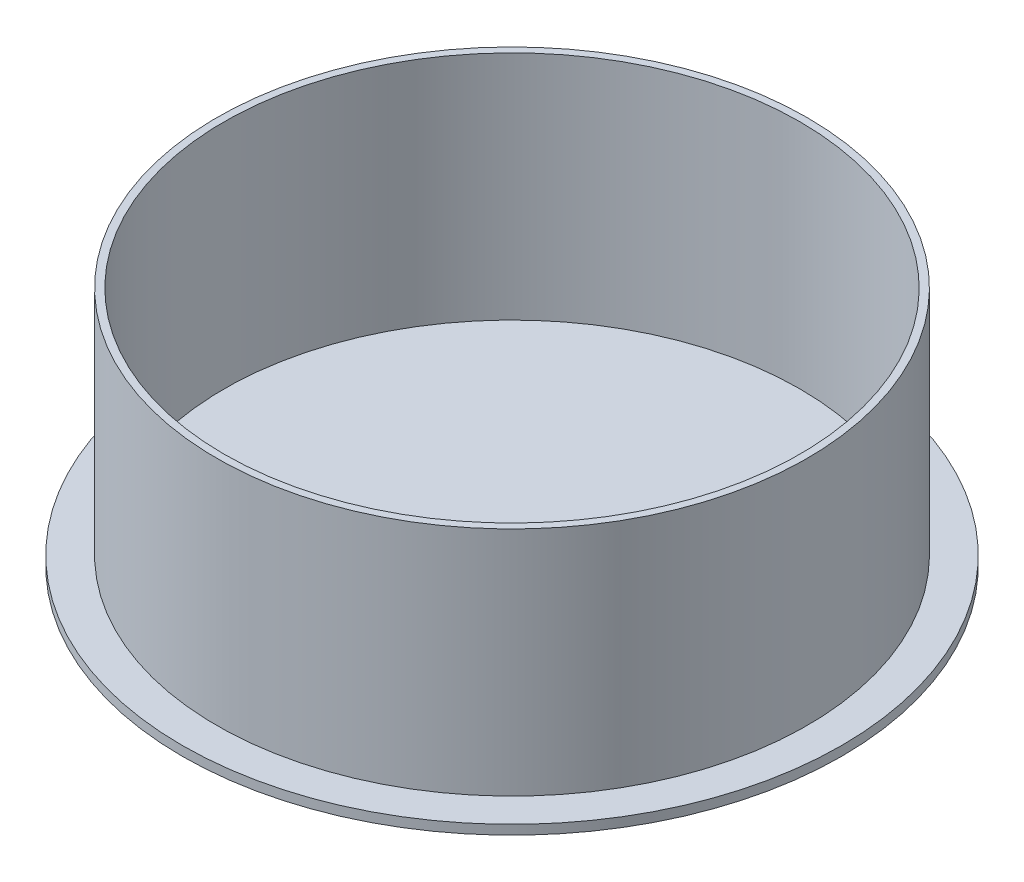
ISO-10303-21;
HEADER;
FILE_DESCRIPTION(('STEP AP214'),'2;1');
FILE_NAME('part.step','',(''),(''),'','','');
FILE_SCHEMA(('AUTOMOTIVE_DESIGN { 1 0 10303 214 1 1 1 1 }'));
ENDSEC;
DATA;
#1=APPLICATION_CONTEXT('core data for automotive mechanical design processes');
#2=APPLICATION_PROTOCOL_DEFINITION('international standard','automotive_design',2000,#1);
#3=PRODUCT_CONTEXT('',#1,'mechanical');
#4=PRODUCT('Part','Part','',(#3));
#5=PRODUCT_RELATED_PRODUCT_CATEGORY('part','',(#4));
#6=PRODUCT_DEFINITION_FORMATION('','',#4);
#7=PRODUCT_DEFINITION_CONTEXT('part definition',#1,'design');
#8=PRODUCT_DEFINITION('design','',#6,#7);
#9=PRODUCT_DEFINITION_SHAPE('','',#8);
#10=(LENGTH_UNIT() NAMED_UNIT(*) SI_UNIT(.MILLI.,.METRE.));
#11=(NAMED_UNIT(*) PLANE_ANGLE_UNIT() SI_UNIT($,.RADIAN.));
#12=(NAMED_UNIT(*) SI_UNIT($,.STERADIAN.) SOLID_ANGLE_UNIT());
#13=UNCERTAINTY_MEASURE_WITH_UNIT(LENGTH_MEASURE(1.E-05),#10,'distance_accuracy_value','');
#14=(GEOMETRIC_REPRESENTATION_CONTEXT(3) GLOBAL_UNCERTAINTY_ASSIGNED_CONTEXT((#13)) GLOBAL_UNIT_ASSIGNED_CONTEXT((#10,
#11,#12)) REPRESENTATION_CONTEXT('',''));
#15=CARTESIAN_POINT('',(0.,0.,0.));
#16=DIRECTION('',(0.,0.,1.));
#17=DIRECTION('',(1.,0.,0.));
#18=AXIS2_PLACEMENT_3D('',#15,#16,#17);
#19=CARTESIAN_POINT('',(0.,0.,0.));
#20=DIRECTION('',(0.,-1.,0.));
#21=DIRECTION('',(0.,0.,-1.));
#22=AXIS2_PLACEMENT_3D('',#19,#20,#21);
#23=PLANE('',#22);
#24=CARTESIAN_POINT('',(0.,0.,0.));
#25=DIRECTION('',(0.,-1.,0.));
#26=DIRECTION('',(0.,0.,-1.));
#27=AXIS2_PLACEMENT_3D('',#24,#25,#26);
#28=CIRCLE('',#27,77.724);
#29=CARTESIAN_POINT('',(0.,0.,-77.724));
#30=VERTEX_POINT('',#29);
#31=EDGE_CURVE('E10',#30,#30,#28,.T.);
#32=ORIENTED_EDGE('',*,*,#31,.F.);
#33=EDGE_LOOP('',(#32));
#34=FACE_BOUND('',#33,.T.);
#35=ADVANCED_FACE('F32',(#34),#23,.F.);
#36=CARTESIAN_POINT('',(0.,0.,0.));
#37=DIRECTION('',(0.,-1.,0.));
#38=DIRECTION('',(0.,0.,-1.));
#39=AXIS2_PLACEMENT_3D('',#36,#37,#38);
#40=CYLINDRICAL_SURFACE('',#39,77.724);
#41=CARTESIAN_POINT('',(0.,62.46,0.));
#42=DIRECTION('',(0.,-1.,0.));
#43=DIRECTION('',(0.,0.,-1.));
#44=AXIS2_PLACEMENT_3D('',#41,#42,#43);
#45=CIRCLE('',#44,77.724);
#46=CARTESIAN_POINT('',(0.,62.46,-77.724));
#47=VERTEX_POINT('',#46);
#48=EDGE_CURVE('E38',#47,#47,#45,.T.);
#49=ORIENTED_EDGE('',*,*,#48,.F.);
#50=EDGE_LOOP('',(#49));
#51=FACE_BOUND('',#50,.T.);
#52=ORIENTED_EDGE('',*,*,#31,.T.);
#53=EDGE_LOOP('',(#52));
#54=FACE_BOUND('',#53,.T.);
#55=ADVANCED_FACE('F80',(#51,#54),#40,.F.);
#56=CARTESIAN_POINT('',(-77.724,62.46,0.));
#57=DIRECTION('',(0.,-1.,0.));
#58=DIRECTION('',(0.,0.,-1.));
#59=AXIS2_PLACEMENT_3D('',#56,#57,#58);
#60=PLANE('',#59);
#61=CARTESIAN_POINT('',(0.,62.46,0.));
#62=DIRECTION('',(0.,-1.,0.));
#63=DIRECTION('',(0.,0.,-1.));
#64=AXIS2_PLACEMENT_3D('',#61,#62,#63);
#65=CIRCLE('',#64,79.6798);
#66=CARTESIAN_POINT('',(0.,62.46,-79.6798));
#67=VERTEX_POINT('',#66);
#68=EDGE_CURVE('E42',#67,#67,#65,.T.);
#69=ORIENTED_EDGE('',*,*,#68,.F.);
#70=EDGE_LOOP('',(#69));
#71=FACE_BOUND('',#70,.T.);
#72=ORIENTED_EDGE('',*,*,#48,.T.);
#73=EDGE_LOOP('',(#72));
#74=FACE_BOUND('',#73,.T.);
#75=ADVANCED_FACE('F75',(#71,#74),#60,.F.);
#76=CARTESIAN_POINT('',(0.,0.,0.));
#77=DIRECTION('',(0.,-1.,0.));
#78=DIRECTION('',(0.,0.,-1.));
#79=AXIS2_PLACEMENT_3D('',#76,#77,#78);
#80=CYLINDRICAL_SURFACE('',#79,79.6798);
#81=CARTESIAN_POINT('',(0.,0.,0.));
#82=DIRECTION('',(0.,-1.,0.));
#83=DIRECTION('',(0.,0.,-1.));
#84=AXIS2_PLACEMENT_3D('',#81,#82,#83);
#85=CIRCLE('',#84,79.6798);
#86=CARTESIAN_POINT('',(0.,0.,-79.6798));
#87=VERTEX_POINT('',#86);
#88=EDGE_CURVE('E46',#87,#87,#85,.T.);
#89=ORIENTED_EDGE('',*,*,#88,.F.);
#90=EDGE_LOOP('',(#89));
#91=FACE_BOUND('',#90,.T.);
#92=ORIENTED_EDGE('',*,*,#68,.T.);
#93=EDGE_LOOP('',(#92));
#94=FACE_BOUND('',#93,.T.);
#95=ADVANCED_FACE('F69',(#91,#94),#80,.T.);
#96=CARTESIAN_POINT('',(-79.6798,0.,0.));
#97=DIRECTION('',(0.,-1.,0.));
#98=DIRECTION('',(0.,0.,-1.));
#99=AXIS2_PLACEMENT_3D('',#96,#97,#98);
#100=PLANE('',#99);
#101=CARTESIAN_POINT('',(0.,0.,0.));
#102=DIRECTION('',(0.,-1.,0.));
#103=DIRECTION('',(0.,0.,-1.));
#104=AXIS2_PLACEMENT_3D('',#101,#102,#103);
#105=CIRCLE('',#104,89.);
#106=CARTESIAN_POINT('',(0.,0.,-89.));
#107=VERTEX_POINT('',#106);
#108=EDGE_CURVE('E51',#107,#107,#105,.T.);
#109=ORIENTED_EDGE('',*,*,#108,.F.);
#110=EDGE_LOOP('',(#109));
#111=FACE_BOUND('',#110,.T.);
#112=ORIENTED_EDGE('',*,*,#88,.T.);
#113=EDGE_LOOP('',(#112));
#114=FACE_BOUND('',#113,.T.);
#115=ADVANCED_FACE('F63',(#111,#114),#100,.F.);
#116=CARTESIAN_POINT('',(0.,0.,0.));
#117=DIRECTION('',(0.,-1.,0.));
#118=DIRECTION('',(0.,0.,-1.));
#119=AXIS2_PLACEMENT_3D('',#116,#117,#118);
#120=CYLINDRICAL_SURFACE('',#119,89.);
#121=CARTESIAN_POINT('',(0.,-2.54,0.));
#122=DIRECTION('',(0.,-1.,0.));
#123=DIRECTION('',(0.,0.,-1.));
#124=AXIS2_PLACEMENT_3D('',#121,#122,#123);
#125=CIRCLE('',#124,89.);
#126=CARTESIAN_POINT('',(0.,-2.54,-89.));
#127=VERTEX_POINT('',#126);
#128=EDGE_CURVE('E54',#127,#127,#125,.T.);
#129=ORIENTED_EDGE('',*,*,#128,.F.);
#130=EDGE_LOOP('',(#129));
#131=FACE_BOUND('',#130,.T.);
#132=ORIENTED_EDGE('',*,*,#108,.T.);
#133=EDGE_LOOP('',(#132));
#134=FACE_BOUND('',#133,.T.);
#135=ADVANCED_FACE('F60',(#131,#134),#120,.T.);
#136=CARTESIAN_POINT('',(-89.,-2.54,0.));
#137=DIRECTION('',(0.,1.,0.));
#138=DIRECTION('',(0.,0.,1.));
#139=AXIS2_PLACEMENT_3D('',#136,#137,#138);
#140=PLANE('',#139);
#141=ORIENTED_EDGE('',*,*,#128,.T.);
#142=EDGE_LOOP('',(#141));
#143=FACE_BOUND('',#142,.T.);
#144=ADVANCED_FACE('F58',(#143),#140,.F.);
#145=CLOSED_SHELL('',(#35,#55,#75,#95,#115,#135,#144));
#146=MANIFOLD_SOLID_BREP('B2',#145);
#147=ADVANCED_BREP_SHAPE_REPRESENTATION('',(#18,#146),#14);
#148=SHAPE_DEFINITION_REPRESENTATION(#9,#147);
ENDSEC;
END-ISO-10303-21;
